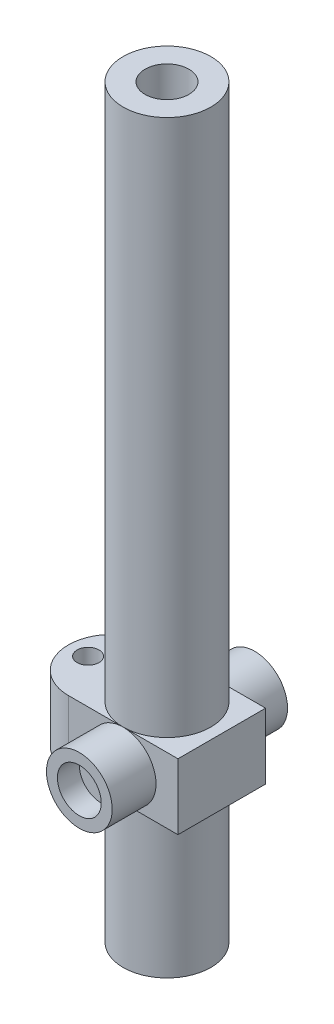
ISO-10303-21;
HEADER;
FILE_DESCRIPTION(('STEP AP214'),'2;1');
FILE_NAME('part.step','',(''),(''),'','','');
FILE_SCHEMA(('AUTOMOTIVE_DESIGN { 1 0 10303 214 1 1 1 1 }'));
ENDSEC;
DATA;
#1=APPLICATION_CONTEXT('core data for automotive mechanical design processes');
#2=APPLICATION_PROTOCOL_DEFINITION('international standard','automotive_design',2000,#1);
#3=PRODUCT_CONTEXT('',#1,'mechanical');
#4=PRODUCT('Part','Part','',(#3));
#5=PRODUCT_RELATED_PRODUCT_CATEGORY('part','',(#4));
#6=PRODUCT_DEFINITION_FORMATION('','',#4);
#7=PRODUCT_DEFINITION_CONTEXT('part definition',#1,'design');
#8=PRODUCT_DEFINITION('design','',#6,#7);
#9=PRODUCT_DEFINITION_SHAPE('','',#8);
#10=(LENGTH_UNIT() NAMED_UNIT(*) SI_UNIT(.MILLI.,.METRE.));
#11=(NAMED_UNIT(*) PLANE_ANGLE_UNIT() SI_UNIT($,.RADIAN.));
#12=(NAMED_UNIT(*) SI_UNIT($,.STERADIAN.) SOLID_ANGLE_UNIT());
#13=UNCERTAINTY_MEASURE_WITH_UNIT(LENGTH_MEASURE(1.E-05),#10,'distance_accuracy_value','');
#14=(GEOMETRIC_REPRESENTATION_CONTEXT(3) GLOBAL_UNCERTAINTY_ASSIGNED_CONTEXT((#13)) GLOBAL_UNIT_ASSIGNED_CONTEXT((#10,
#11,#12)) REPRESENTATION_CONTEXT('',''));
#15=CARTESIAN_POINT('',(0.,0.,0.));
#16=DIRECTION('',(0.,0.,1.));
#17=DIRECTION('',(1.,0.,0.));
#18=AXIS2_PLACEMENT_3D('',#15,#16,#17);
#19=CARTESIAN_POINT('',(0.,0.,10.));
#20=DIRECTION('',(0.,0.,1.));
#21=DIRECTION('',(1.,0.,0.));
#22=AXIS2_PLACEMENT_3D('',#19,#20,#21);
#23=PLANE('',#22);
#24=DIRECTION('',(1.,0.,0.));
#25=VECTOR('',#24,1.);
#26=CARTESIAN_POINT('',(-12.5,32.5,10.));
#27=LINE('',#26,#25);
#28=CARTESIAN_POINT('',(-12.5,32.5,10.));
#29=VERTEX_POINT('',#28);
#30=CARTESIAN_POINT('',(0.,32.5,10.));
#31=VERTEX_POINT('',#30);
#32=EDGE_CURVE('E124',#29,#31,#27,.T.);
#33=ORIENTED_EDGE('',*,*,#32,.T.);
#34=CARTESIAN_POINT('',(0.,40.,10.));
#35=DIRECTION('',(0.,0.,1.));
#36=DIRECTION('',(1.,0.,0.));
#37=AXIS2_PLACEMENT_3D('',#34,#35,#36);
#38=CIRCLE('',#37,7.5);
#39=CARTESIAN_POINT('',(0.,47.5,10.));
#40=VERTEX_POINT('',#39);
#41=EDGE_CURVE('E47',#31,#40,#38,.F.);
#42=ORIENTED_EDGE('',*,*,#41,.T.);
#43=DIRECTION('',(-1.,0.,0.));
#44=VECTOR('',#43,1.);
#45=CARTESIAN_POINT('',(-12.5,47.5,10.));
#46=LINE('',#45,#44);
#47=CARTESIAN_POINT('',(-12.5,47.5,10.));
#48=VERTEX_POINT('',#47);
#49=EDGE_CURVE('E163',#40,#48,#46,.T.);
#50=ORIENTED_EDGE('',*,*,#49,.T.);
#51=DIRECTION('',(0.,-1.,0.));
#52=VECTOR('',#51,1.);
#53=CARTESIAN_POINT('',(-12.5,47.5,10.));
#54=LINE('',#53,#52);
#55=EDGE_CURVE('E94',#48,#29,#54,.T.);
#56=ORIENTED_EDGE('',*,*,#55,.T.);
#57=EDGE_LOOP('',(#33,#42,#50,#56));
#58=FACE_BOUND('',#57,.T.);
#59=ADVANCED_FACE('F33',(#58),#23,.T.);
#60=CARTESIAN_POINT('',(0.,0.,-10.));
#61=DIRECTION('',(0.,0.,1.));
#62=DIRECTION('',(1.,0.,0.));
#63=AXIS2_PLACEMENT_3D('',#60,#61,#62);
#64=PLANE('',#63);
#65=CARTESIAN_POINT('',(0.,40.,-10.));
#66=DIRECTION('',(0.,0.,1.));
#67=DIRECTION('',(1.,0.,0.));
#68=AXIS2_PLACEMENT_3D('',#65,#66,#67);
#69=CIRCLE('',#68,7.5);
#70=CARTESIAN_POINT('',(0.,32.5,-10.));
#71=VERTEX_POINT('',#70);
#72=CARTESIAN_POINT('',(0.,47.5,-10.));
#73=VERTEX_POINT('',#72);
#74=EDGE_CURVE('E149',#71,#73,#69,.F.);
#75=ORIENTED_EDGE('',*,*,#74,.F.);
#76=DIRECTION('',(1.,0.,0.));
#77=VECTOR('',#76,1.);
#78=CARTESIAN_POINT('',(-12.5,32.5,-10.));
#79=LINE('',#78,#77);
#80=CARTESIAN_POINT('',(-12.5,32.5,-10.));
#81=VERTEX_POINT('',#80);
#82=EDGE_CURVE('E113',#81,#71,#79,.T.);
#83=ORIENTED_EDGE('',*,*,#82,.F.);
#84=DIRECTION('',(0.,-1.,0.));
#85=VECTOR('',#84,1.);
#86=CARTESIAN_POINT('',(-12.5,47.5,-10.));
#87=LINE('',#86,#85);
#88=CARTESIAN_POINT('',(-12.5,47.5,-10.));
#89=VERTEX_POINT('',#88);
#90=EDGE_CURVE('E91',#89,#81,#87,.T.);
#91=ORIENTED_EDGE('',*,*,#90,.F.);
#92=DIRECTION('',(-1.,0.,0.));
#93=VECTOR('',#92,1.);
#94=CARTESIAN_POINT('',(-12.5,47.5,-10.));
#95=LINE('',#94,#93);
#96=EDGE_CURVE('E103',#73,#89,#95,.T.);
#97=ORIENTED_EDGE('',*,*,#96,.F.);
#98=EDGE_LOOP('',(#75,#83,#91,#97));
#99=FACE_BOUND('',#98,.T.);
#100=ADVANCED_FACE('F112',(#99),#64,.F.);
#101=CARTESIAN_POINT('',(0.,170.,0.));
#102=DIRECTION('',(0.,-1.,0.));
#103=DIRECTION('',(0.,0.,-1.));
#104=AXIS2_PLACEMENT_3D('',#101,#102,#103);
#105=CYLINDRICAL_SURFACE('',#104,10.);
#106=CARTESIAN_POINT('',(0.,170.,0.));
#107=DIRECTION('',(0.,1.,0.));
#108=DIRECTION('',(0.,0.,1.));
#109=AXIS2_PLACEMENT_3D('',#106,#107,#108);
#110=CIRCLE('',#109,10.);
#111=CARTESIAN_POINT('',(0.,170.,10.));
#112=VERTEX_POINT('',#111);
#113=EDGE_CURVE('E128',#112,#112,#110,.T.);
#114=ORIENTED_EDGE('',*,*,#113,.F.);
#115=EDGE_LOOP('',(#114));
#116=FACE_BOUND('',#115,.T.);
#117=CARTESIAN_POINT('',(0.,47.5,0.));
#118=DIRECTION('',(0.,-1.,0.));
#119=DIRECTION('',(0.,0.,-1.));
#120=AXIS2_PLACEMENT_3D('',#117,#118,#119);
#121=CIRCLE('',#120,10.);
#122=EDGE_CURVE('E11',#73,#40,#121,.T.);
#123=ORIENTED_EDGE('',*,*,#122,.F.);
#124=EDGE_CURVE('E37',#40,#73,#121,.T.);
#125=ORIENTED_EDGE('',*,*,#124,.F.);
#126=EDGE_LOOP('',(#123,#125));
#127=FACE_BOUND('',#126,.T.);
#128=ADVANCED_FACE('F35',(#116,#127),#105,.T.);
#129=CARTESIAN_POINT('',(0.,170.,0.));
#130=DIRECTION('',(0.,1.,0.));
#131=DIRECTION('',(0.,0.,1.));
#132=AXIS2_PLACEMENT_3D('',#129,#130,#131);
#133=PLANE('',#132);
#134=CARTESIAN_POINT('',(0.,170.,0.));
#135=DIRECTION('',(0.,1.,0.));
#136=DIRECTION('',(0.,0.,1.));
#137=AXIS2_PLACEMENT_3D('',#134,#135,#136);
#138=CIRCLE('',#137,5.);
#139=CARTESIAN_POINT('',(0.,170.,5.));
#140=VERTEX_POINT('',#139);
#141=EDGE_CURVE('E232',#140,#140,#138,.T.);
#142=ORIENTED_EDGE('',*,*,#141,.F.);
#143=EDGE_LOOP('',(#142));
#144=FACE_BOUND('',#143,.T.);
#145=ORIENTED_EDGE('',*,*,#113,.T.);
#146=EDGE_LOOP('',(#145));
#147=FACE_BOUND('',#146,.T.);
#148=ADVANCED_FACE('F206',(#144,#147),#133,.T.);
#149=CARTESIAN_POINT('',(-12.5,47.5,10.));
#150=DIRECTION('',(0.,-1.,0.));
#151=DIRECTION('',(0.,0.,-1.));
#152=AXIS2_PLACEMENT_3D('',#149,#150,#151);
#153=PLANE('',#152);
#154=CARTESIAN_POINT('',(12.5,47.5,-10.));
#155=VERTEX_POINT('',#154);
#156=EDGE_CURVE('E109',#155,#73,#95,.T.);
#157=ORIENTED_EDGE('',*,*,#156,.T.);
#158=ORIENTED_EDGE('',*,*,#122,.T.);
#159=CARTESIAN_POINT('',(12.5,47.5,10.));
#160=VERTEX_POINT('',#159);
#161=EDGE_CURVE('E164',#160,#40,#46,.T.);
#162=ORIENTED_EDGE('',*,*,#161,.F.);
#163=DIRECTION('',(0.,0.,-1.));
#164=VECTOR('',#163,1.);
#165=CARTESIAN_POINT('',(12.5,47.5,10.));
#166=LINE('',#165,#164);
#167=EDGE_CURVE('E123',#160,#155,#166,.T.);
#168=ORIENTED_EDGE('',*,*,#167,.T.);
#169=EDGE_LOOP('',(#157,#158,#162,#168));
#170=FACE_BOUND('',#169,.T.);
#171=ADVANCED_FACE('F175',(#170),#153,.F.);
#172=CARTESIAN_POINT('',(-12.5,32.5,10.));
#173=DIRECTION('',(0.,1.,0.));
#174=DIRECTION('',(0.,0.,1.));
#175=AXIS2_PLACEMENT_3D('',#172,#173,#174);
#176=PLANE('',#175);
#177=CARTESIAN_POINT('',(12.5,32.5,10.));
#178=VERTEX_POINT('',#177);
#179=EDGE_CURVE('E144',#31,#178,#27,.T.);
#180=ORIENTED_EDGE('',*,*,#179,.F.);
#181=CARTESIAN_POINT('',(0.,32.5,0.));
#182=DIRECTION('',(0.,1.,0.));
#183=DIRECTION('',(0.,0.,1.));
#184=AXIS2_PLACEMENT_3D('',#181,#182,#183);
#185=CIRCLE('',#184,10.);
#186=EDGE_CURVE('E134',#31,#71,#185,.T.);
#187=ORIENTED_EDGE('',*,*,#186,.T.);
#188=CARTESIAN_POINT('',(12.5,32.5,-10.));
#189=VERTEX_POINT('',#188);
#190=EDGE_CURVE('E114',#71,#189,#79,.T.);
#191=ORIENTED_EDGE('',*,*,#190,.T.);
#192=DIRECTION('',(0.,0.,-1.));
#193=VECTOR('',#192,1.);
#194=CARTESIAN_POINT('',(12.5,32.5,10.));
#195=LINE('',#194,#193);
#196=EDGE_CURVE('E120',#178,#189,#195,.T.);
#197=ORIENTED_EDGE('',*,*,#196,.F.);
#198=EDGE_LOOP('',(#180,#187,#191,#197));
#199=FACE_BOUND('',#198,.T.);
#200=ADVANCED_FACE('F142',(#199),#176,.F.);
#201=ORIENTED_EDGE('',*,*,#161,.T.);
#202=EDGE_CURVE('E151',#40,#31,#38,.F.);
#203=ORIENTED_EDGE('',*,*,#202,.T.);
#204=ORIENTED_EDGE('',*,*,#179,.T.);
#205=DIRECTION('',(0.,1.,0.));
#206=VECTOR('',#205,1.);
#207=CARTESIAN_POINT('',(12.5,47.5,10.));
#208=LINE('',#207,#206);
#209=EDGE_CURVE('E119',#178,#160,#208,.T.);
#210=ORIENTED_EDGE('',*,*,#209,.T.);
#211=EDGE_LOOP('',(#201,#203,#204,#210));
#212=FACE_BOUND('',#211,.T.);
#213=ADVANCED_FACE('F177',(#212),#23,.T.);
#214=EDGE_CURVE('E55',#73,#71,#69,.F.);
#215=ORIENTED_EDGE('',*,*,#214,.F.);
#216=ORIENTED_EDGE('',*,*,#156,.F.);
#217=DIRECTION('',(0.,1.,0.));
#218=VECTOR('',#217,1.);
#219=CARTESIAN_POINT('',(12.5,47.5,-10.));
#220=LINE('',#219,#218);
#221=EDGE_CURVE('E110',#189,#155,#220,.T.);
#222=ORIENTED_EDGE('',*,*,#221,.F.);
#223=ORIENTED_EDGE('',*,*,#190,.F.);
#224=EDGE_LOOP('',(#215,#216,#222,#223));
#225=FACE_BOUND('',#224,.T.);
#226=ADVANCED_FACE('F181',(#225),#64,.F.);
#227=CARTESIAN_POINT('',(12.5,47.5,10.));
#228=DIRECTION('',(-1.,0.,0.));
#229=DIRECTION('',(0.,-1.,0.));
#230=AXIS2_PLACEMENT_3D('',#227,#228,#229);
#231=PLANE('',#230);
#232=ORIENTED_EDGE('',*,*,#221,.T.);
#233=ORIENTED_EDGE('',*,*,#167,.F.);
#234=ORIENTED_EDGE('',*,*,#209,.F.);
#235=ORIENTED_EDGE('',*,*,#196,.T.);
#236=EDGE_LOOP('',(#232,#233,#234,#235));
#237=FACE_BOUND('',#236,.T.);
#238=ADVANCED_FACE('F179',(#237),#231,.F.);
#239=CARTESIAN_POINT('',(-18.,47.5,0.));
#240=DIRECTION('',(0.,-1.,0.));
#241=DIRECTION('',(0.,0.,-1.));
#242=AXIS2_PLACEMENT_3D('',#239,#240,#241);
#243=CIRCLE('',#242,2.5);
#244=CARTESIAN_POINT('',(-18.,47.5,-2.5));
#245=VERTEX_POINT('',#244);
#246=EDGE_CURVE('E217',#245,#245,#243,.T.);
#247=ORIENTED_EDGE('',*,*,#246,.T.);
#248=EDGE_LOOP('',(#247));
#249=FACE_BOUND('',#248,.T.);
#250=ORIENTED_EDGE('',*,*,#49,.F.);
#251=ORIENTED_EDGE('',*,*,#124,.T.);
#252=ORIENTED_EDGE('',*,*,#96,.T.);
#253=CARTESIAN_POINT('',(-12.5,47.5,0.));
#254=DIRECTION('',(0.,-1.,0.));
#255=DIRECTION('',(0.,0.,-1.));
#256=AXIS2_PLACEMENT_3D('',#253,#254,#255);
#257=CIRCLE('',#256,10.);
#258=EDGE_CURVE('E87',#48,#89,#257,.T.);
#259=ORIENTED_EDGE('',*,*,#258,.F.);
#260=EDGE_LOOP('',(#250,#251,#252,#259));
#261=FACE_BOUND('',#260,.T.);
#262=ADVANCED_FACE('F104',(#249,#261),#153,.F.);
#263=CARTESIAN_POINT('',(-18.,32.5,0.));
#264=DIRECTION('',(0.,-1.,0.));
#265=DIRECTION('',(0.,0.,-1.));
#266=AXIS2_PLACEMENT_3D('',#263,#264,#265);
#267=CIRCLE('',#266,2.5);
#268=CARTESIAN_POINT('',(-18.,32.5,-2.5));
#269=VERTEX_POINT('',#268);
#270=EDGE_CURVE('E216',#269,#269,#267,.T.);
#271=ORIENTED_EDGE('',*,*,#270,.F.);
#272=EDGE_LOOP('',(#271));
#273=FACE_BOUND('',#272,.T.);
#274=ORIENTED_EDGE('',*,*,#82,.T.);
#275=EDGE_CURVE('E131',#71,#31,#185,.T.);
#276=ORIENTED_EDGE('',*,*,#275,.T.);
#277=ORIENTED_EDGE('',*,*,#32,.F.);
#278=CARTESIAN_POINT('',(-12.5,32.5,0.));
#279=DIRECTION('',(0.,-1.,0.));
#280=DIRECTION('',(0.,0.,-1.));
#281=AXIS2_PLACEMENT_3D('',#278,#279,#280);
#282=CIRCLE('',#281,10.);
#283=EDGE_CURVE('E99',#29,#81,#282,.T.);
#284=ORIENTED_EDGE('',*,*,#283,.T.);
#285=EDGE_LOOP('',(#274,#276,#277,#284));
#286=FACE_BOUND('',#285,.T.);
#287=ADVANCED_FACE('F187',(#273,#286),#176,.F.);
#288=CARTESIAN_POINT('',(0.,0.,0.));
#289=DIRECTION('',(0.,1.,0.));
#290=DIRECTION('',(0.,0.,1.));
#291=AXIS2_PLACEMENT_3D('',#288,#289,#290);
#292=PLANE('',#291);
#293=CARTESIAN_POINT('',(0.,0.,0.));
#294=DIRECTION('',(0.,1.,0.));
#295=DIRECTION('',(0.,0.,1.));
#296=AXIS2_PLACEMENT_3D('',#293,#294,#295);
#297=CIRCLE('',#296,10.);
#298=CARTESIAN_POINT('',(0.,0.,10.));
#299=VERTEX_POINT('',#298);
#300=EDGE_CURVE('E127',#299,#299,#297,.T.);
#301=ORIENTED_EDGE('',*,*,#300,.F.);
#302=EDGE_LOOP('',(#301));
#303=FACE_BOUND('',#302,.T.);
#304=ADVANCED_FACE('F208',(#303),#292,.F.);
#305=ORIENTED_EDGE('',*,*,#300,.T.);
#306=EDGE_LOOP('',(#305));
#307=FACE_BOUND('',#306,.T.);
#308=ORIENTED_EDGE('',*,*,#186,.F.);
#309=ORIENTED_EDGE('',*,*,#275,.F.);
#310=EDGE_LOOP('',(#308,#309));
#311=FACE_BOUND('',#310,.T.);
#312=ADVANCED_FACE('F147',(#307,#311),#105,.T.);
#313=CARTESIAN_POINT('',(0.,40.,-20.));
#314=DIRECTION('',(0.,0.,1.));
#315=DIRECTION('',(1.,0.,0.));
#316=AXIS2_PLACEMENT_3D('',#313,#314,#315);
#317=PLANE('',#316);
#318=CARTESIAN_POINT('',(0.,40.,-20.));
#319=DIRECTION('',(0.,0.,-1.));
#320=DIRECTION('',(-1.,0.,0.));
#321=AXIS2_PLACEMENT_3D('',#318,#319,#320);
#322=CIRCLE('',#321,5.);
#323=CARTESIAN_POINT('',(-5.,40.,-20.));
#324=VERTEX_POINT('',#323);
#325=EDGE_CURVE('E226',#324,#324,#322,.T.);
#326=ORIENTED_EDGE('',*,*,#325,.F.);
#327=EDGE_LOOP('',(#326));
#328=FACE_BOUND('',#327,.T.);
#329=CARTESIAN_POINT('',(0.,40.,-20.));
#330=DIRECTION('',(0.,0.,1.));
#331=DIRECTION('',(1.,0.,0.));
#332=AXIS2_PLACEMENT_3D('',#329,#330,#331);
#333=CIRCLE('',#332,7.5);
#334=CARTESIAN_POINT('',(7.5,40.,-20.));
#335=VERTEX_POINT('',#334);
#336=EDGE_CURVE('E156',#335,#335,#333,.T.);
#337=ORIENTED_EDGE('',*,*,#336,.F.);
#338=EDGE_LOOP('',(#337));
#339=FACE_BOUND('',#338,.T.);
#340=ADVANCED_FACE('F251',(#328,#339),#317,.F.);
#341=CARTESIAN_POINT('',(0.,40.,20.));
#342=DIRECTION('',(0.,0.,-1.));
#343=DIRECTION('',(-1.,0.,0.));
#344=AXIS2_PLACEMENT_3D('',#341,#342,#343);
#345=CYLINDRICAL_SURFACE('',#344,7.5);
#346=ORIENTED_EDGE('',*,*,#336,.T.);
#347=EDGE_LOOP('',(#346));
#348=FACE_BOUND('',#347,.T.);
#349=ORIENTED_EDGE('',*,*,#214,.T.);
#350=ORIENTED_EDGE('',*,*,#74,.T.);
#351=EDGE_LOOP('',(#349,#350));
#352=FACE_BOUND('',#351,.T.);
#353=ADVANCED_FACE('F153',(#348,#352),#345,.T.);
#354=ORIENTED_EDGE('',*,*,#41,.F.);
#355=ORIENTED_EDGE('',*,*,#202,.F.);
#356=EDGE_LOOP('',(#354,#355));
#357=FACE_BOUND('',#356,.T.);
#358=CARTESIAN_POINT('',(0.,40.,20.));
#359=DIRECTION('',(0.,0.,1.));
#360=DIRECTION('',(1.,0.,0.));
#361=AXIS2_PLACEMENT_3D('',#358,#359,#360);
#362=CIRCLE('',#361,7.5);
#363=CARTESIAN_POINT('',(7.5,40.,20.));
#364=VERTEX_POINT('',#363);
#365=EDGE_CURVE('E154',#364,#364,#362,.T.);
#366=ORIENTED_EDGE('',*,*,#365,.F.);
#367=EDGE_LOOP('',(#366));
#368=FACE_BOUND('',#367,.T.);
#369=ADVANCED_FACE('F262',(#357,#368),#345,.T.);
#370=CARTESIAN_POINT('',(0.,40.,20.));
#371=DIRECTION('',(0.,0.,1.));
#372=DIRECTION('',(1.,0.,0.));
#373=AXIS2_PLACEMENT_3D('',#370,#371,#372);
#374=PLANE('',#373);
#375=CARTESIAN_POINT('',(0.,40.,20.));
#376=DIRECTION('',(0.,0.,-1.));
#377=DIRECTION('',(-1.,0.,0.));
#378=AXIS2_PLACEMENT_3D('',#375,#376,#377);
#379=CIRCLE('',#378,5.);
#380=CARTESIAN_POINT('',(-5.,40.,20.));
#381=VERTEX_POINT('',#380);
#382=EDGE_CURVE('E98',#381,#381,#379,.T.);
#383=ORIENTED_EDGE('',*,*,#382,.T.);
#384=EDGE_LOOP('',(#383));
#385=FACE_BOUND('',#384,.T.);
#386=ORIENTED_EDGE('',*,*,#365,.T.);
#387=EDGE_LOOP('',(#386));
#388=FACE_BOUND('',#387,.T.);
#389=ADVANCED_FACE('F267',(#385,#388),#374,.T.);
#390=CARTESIAN_POINT('',(0.,90.,0.));
#391=DIRECTION('',(0.,1.,0.));
#392=DIRECTION('',(0.,0.,1.));
#393=AXIS2_PLACEMENT_3D('',#390,#391,#392);
#394=CYLINDRICAL_SURFACE('',#393,5.);
#395=CARTESIAN_POINT('',(0.,90.,0.));
#396=DIRECTION('',(0.,1.,0.));
#397=DIRECTION('',(0.,0.,1.));
#398=AXIS2_PLACEMENT_3D('',#395,#396,#397);
#399=CIRCLE('',#398,5.);
#400=CARTESIAN_POINT('',(0.,90.,5.));
#401=VERTEX_POINT('',#400);
#402=EDGE_CURVE('E235',#401,#401,#399,.T.);
#403=ORIENTED_EDGE('',*,*,#402,.F.);
#404=EDGE_LOOP('',(#403));
#405=FACE_BOUND('',#404,.T.);
#406=ORIENTED_EDGE('',*,*,#141,.T.);
#407=EDGE_LOOP('',(#406));
#408=FACE_BOUND('',#407,.T.);
#409=ADVANCED_FACE('F241',(#405,#408),#394,.F.);
#410=CARTESIAN_POINT('',(0.,90.,0.));
#411=DIRECTION('',(0.,1.,0.));
#412=DIRECTION('',(0.,0.,1.));
#413=AXIS2_PLACEMENT_3D('',#410,#411,#412);
#414=PLANE('',#413);
#415=ORIENTED_EDGE('',*,*,#402,.T.);
#416=EDGE_LOOP('',(#415));
#417=FACE_BOUND('',#416,.T.);
#418=ADVANCED_FACE('F280',(#417),#414,.T.);
#419=CARTESIAN_POINT('',(0.,40.,-15.));
#420=DIRECTION('',(0.,0.,-1.));
#421=DIRECTION('',(-1.,0.,0.));
#422=AXIS2_PLACEMENT_3D('',#419,#420,#421);
#423=CYLINDRICAL_SURFACE('',#422,5.);
#424=CARTESIAN_POINT('',(0.,40.,-15.));
#425=DIRECTION('',(0.,0.,-1.));
#426=DIRECTION('',(-1.,0.,0.));
#427=AXIS2_PLACEMENT_3D('',#424,#425,#426);
#428=CIRCLE('',#427,5.);
#429=CARTESIAN_POINT('',(-5.,40.,-15.));
#430=VERTEX_POINT('',#429);
#431=EDGE_CURVE('E229',#430,#430,#428,.T.);
#432=ORIENTED_EDGE('',*,*,#431,.F.);
#433=EDGE_LOOP('',(#432));
#434=FACE_BOUND('',#433,.T.);
#435=ORIENTED_EDGE('',*,*,#325,.T.);
#436=EDGE_LOOP('',(#435));
#437=FACE_BOUND('',#436,.T.);
#438=ADVANCED_FACE('F296',(#434,#437),#423,.F.);
#439=CARTESIAN_POINT('',(0.,40.,-15.));
#440=DIRECTION('',(0.,0.,-1.));
#441=DIRECTION('',(-1.,0.,0.));
#442=AXIS2_PLACEMENT_3D('',#439,#440,#441);
#443=PLANE('',#442);
#444=ORIENTED_EDGE('',*,*,#431,.T.);
#445=EDGE_LOOP('',(#444));
#446=FACE_BOUND('',#445,.T.);
#447=ADVANCED_FACE('F287',(#446),#443,.T.);
#448=CARTESIAN_POINT('',(0.,40.,15.));
#449=DIRECTION('',(0.,0.,1.));
#450=DIRECTION('',(1.,0.,0.));
#451=AXIS2_PLACEMENT_3D('',#448,#449,#450);
#452=CYLINDRICAL_SURFACE('',#451,5.);
#453=CARTESIAN_POINT('',(0.,40.,15.));
#454=DIRECTION('',(0.,0.,-1.));
#455=DIRECTION('',(-1.,0.,0.));
#456=AXIS2_PLACEMENT_3D('',#453,#454,#455);
#457=CIRCLE('',#456,5.);
#458=CARTESIAN_POINT('',(-5.,40.,15.));
#459=VERTEX_POINT('',#458);
#460=EDGE_CURVE('E223',#459,#459,#457,.T.);
#461=ORIENTED_EDGE('',*,*,#460,.T.);
#462=EDGE_LOOP('',(#461));
#463=FACE_BOUND('',#462,.T.);
#464=ORIENTED_EDGE('',*,*,#382,.F.);
#465=EDGE_LOOP('',(#464));
#466=FACE_BOUND('',#465,.T.);
#467=ADVANCED_FACE('F284',(#463,#466),#452,.F.);
#468=CARTESIAN_POINT('',(0.,40.,15.));
#469=DIRECTION('',(0.,0.,1.));
#470=DIRECTION('',(-1.,0.,0.));
#471=AXIS2_PLACEMENT_3D('',#468,#469,#470);
#472=PLANE('',#471);
#473=ORIENTED_EDGE('',*,*,#460,.F.);
#474=EDGE_LOOP('',(#473));
#475=FACE_BOUND('',#474,.T.);
#476=ADVANCED_FACE('F286',(#475),#472,.T.);
#477=CARTESIAN_POINT('',(-12.5,47.5,0.));
#478=DIRECTION('',(0.,-1.,0.));
#479=DIRECTION('',(0.,0.,-1.));
#480=AXIS2_PLACEMENT_3D('',#477,#478,#479);
#481=CYLINDRICAL_SURFACE('',#480,10.);
#482=ORIENTED_EDGE('',*,*,#283,.F.);
#483=ORIENTED_EDGE('',*,*,#55,.F.);
#484=ORIENTED_EDGE('',*,*,#258,.T.);
#485=ORIENTED_EDGE('',*,*,#90,.T.);
#486=EDGE_LOOP('',(#482,#483,#484,#485));
#487=FACE_BOUND('',#486,.T.);
#488=ADVANCED_FACE('F89',(#487),#481,.T.);
#489=CARTESIAN_POINT('',(-18.,47.5,0.));
#490=DIRECTION('',(0.,-1.,0.));
#491=DIRECTION('',(0.,0.,-1.));
#492=AXIS2_PLACEMENT_3D('',#489,#490,#491);
#493=CYLINDRICAL_SURFACE('',#492,2.5);
#494=ORIENTED_EDGE('',*,*,#246,.F.);
#495=EDGE_LOOP('',(#494));
#496=FACE_BOUND('',#495,.T.);
#497=ORIENTED_EDGE('',*,*,#270,.T.);
#498=EDGE_LOOP('',(#497));
#499=FACE_BOUND('',#498,.T.);
#500=ADVANCED_FACE('F357',(#496,#499),#493,.F.);
#501=CLOSED_SHELL('',(#59,#100,#128,#148,#171,#200,#213,#226,#238,#262,#287,#304,#312,#340,#353,
#369,#389,#409,#418,#438,#447,#467,#476,#488,#500));
#502=MANIFOLD_SOLID_BREP('B2',#501);
#503=ADVANCED_BREP_SHAPE_REPRESENTATION('',(#18,#502),#14);
#504=SHAPE_DEFINITION_REPRESENTATION(#9,#503);
ENDSEC;
END-ISO-10303-21;
